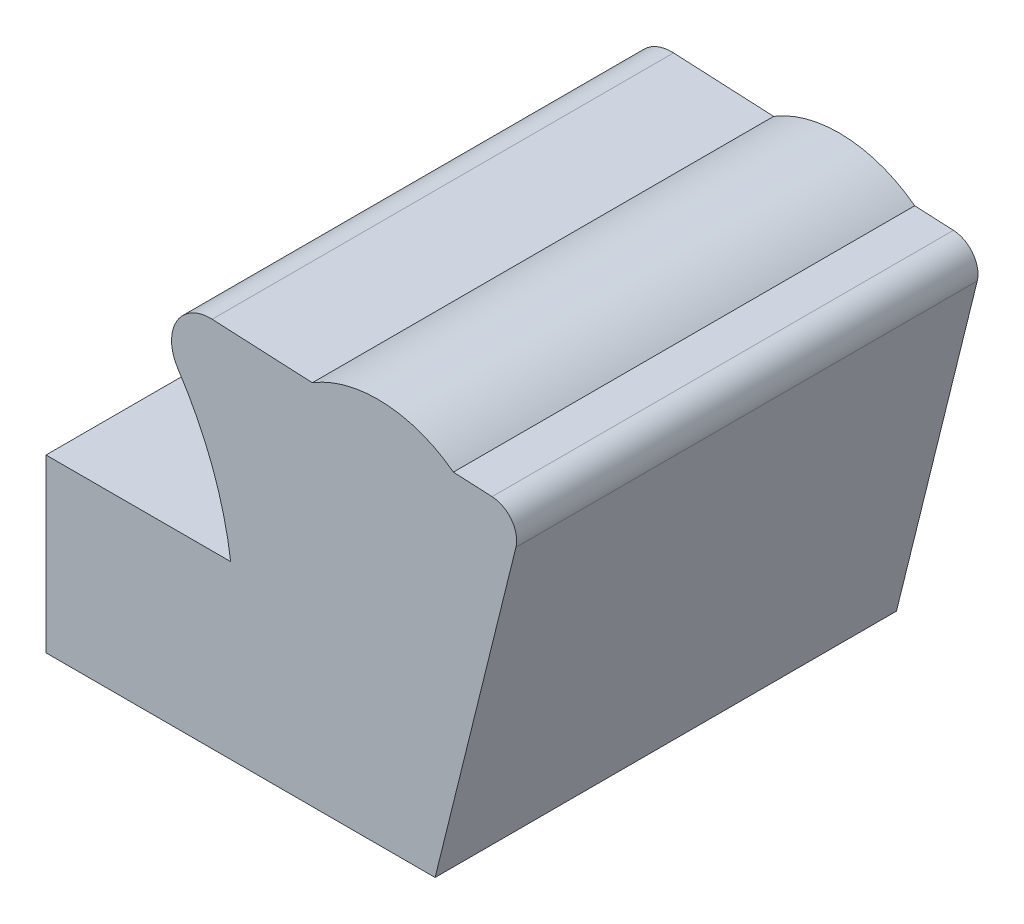
ISO-10303-21;
HEADER;
FILE_DESCRIPTION(('STEP AP214'),'2;1');
FILE_NAME('part.step','',(''),(''),'','','');
FILE_SCHEMA(('AUTOMOTIVE_DESIGN { 1 0 10303 214 1 1 1 1 }'));
ENDSEC;
DATA;
#1=APPLICATION_CONTEXT('core data for automotive mechanical design processes');
#2=APPLICATION_PROTOCOL_DEFINITION('international standard','automotive_design',2000,#1);
#3=PRODUCT_CONTEXT('',#1,'mechanical');
#4=PRODUCT('Part','Part','',(#3));
#5=PRODUCT_RELATED_PRODUCT_CATEGORY('part','',(#4));
#6=PRODUCT_DEFINITION_FORMATION('','',#4);
#7=PRODUCT_DEFINITION_CONTEXT('part definition',#1,'design');
#8=PRODUCT_DEFINITION('design','',#6,#7);
#9=PRODUCT_DEFINITION_SHAPE('','',#8);
#10=(LENGTH_UNIT() NAMED_UNIT(*) SI_UNIT(.MILLI.,.METRE.));
#11=(NAMED_UNIT(*) PLANE_ANGLE_UNIT() SI_UNIT($,.RADIAN.));
#12=(NAMED_UNIT(*) SI_UNIT($,.STERADIAN.) SOLID_ANGLE_UNIT());
#13=UNCERTAINTY_MEASURE_WITH_UNIT(LENGTH_MEASURE(1.E-05),#10,'distance_accuracy_value','');
#14=(GEOMETRIC_REPRESENTATION_CONTEXT(3) GLOBAL_UNCERTAINTY_ASSIGNED_CONTEXT((#13)) GLOBAL_UNIT_ASSIGNED_CONTEXT((#10,
#11,#12)) REPRESENTATION_CONTEXT('',''));
#15=CARTESIAN_POINT('',(0.,0.,0.));
#16=DIRECTION('',(0.,0.,1.));
#17=DIRECTION('',(1.,0.,0.));
#18=AXIS2_PLACEMENT_3D('',#15,#16,#17);
#19=CARTESIAN_POINT('',(117.61894034032,-29.1202319616591,50.));
#20=DIRECTION('',(-0.970692445387368,0.240325147389721,0.));
#21=DIRECTION('',(-0.240325147389721,-0.970692445387368,0.));
#22=AXIS2_PLACEMENT_3D('',#19,#20,#21);
#23=PLANE('',#22);
#24=DIRECTION('',(0.240325147389721,0.970692445387368,0.));
#25=VECTOR('',#24,1.);
#26=CARTESIAN_POINT('',(117.61894034032,-29.1202319616591,-50.));
#27=LINE('',#26,#25);
#28=CARTESIAN_POINT('',(136.603924056532,47.5616320433769,-50.));
#29=VERTEX_POINT('',#28);
#30=CARTESIAN_POINT('',(154.115877694168,118.293810030817,-50.));
#31=VERTEX_POINT('',#30);
#32=EDGE_CURVE('E178',#29,#31,#27,.T.);
#33=ORIENTED_EDGE('',*,*,#32,.T.);
#34=DIRECTION('',(0.,0.,-1.));
#35=VECTOR('',#34,1.);
#36=CARTESIAN_POINT('',(154.115877694168,118.293810030817,50.));
#37=LINE('',#36,#35);
#38=CARTESIAN_POINT('',(154.115877694168,118.293810030817,50.));
#39=VERTEX_POINT('',#38);
#40=EDGE_CURVE('E214',#39,#31,#37,.T.);
#41=ORIENTED_EDGE('',*,*,#40,.F.);
#42=DIRECTION('',(0.240325147389721,0.970692445387368,0.));
#43=VECTOR('',#42,1.);
#44=CARTESIAN_POINT('',(117.61894034032,-29.1202319616591,50.));
#45=LINE('',#44,#43);
#46=CARTESIAN_POINT('',(136.603924056532,47.5616320433769,50.));
#47=VERTEX_POINT('',#46);
#48=EDGE_CURVE('E149',#47,#39,#45,.T.);
#49=ORIENTED_EDGE('',*,*,#48,.F.);
#50=DIRECTION('',(0.,0.,-1.));
#51=VECTOR('',#50,1.);
#52=CARTESIAN_POINT('',(136.603924056532,47.5616320433769,50.));
#53=LINE('',#52,#51);
#54=EDGE_CURVE('E218',#47,#29,#53,.T.);
#55=ORIENTED_EDGE('',*,*,#54,.T.);
#56=EDGE_LOOP('',(#33,#41,#49,#55));
#57=FACE_BOUND('',#56,.T.);
#58=ADVANCED_FACE('F40',(#57),#23,.F.);
#59=CARTESIAN_POINT('',(148.680000000001,119.639630856199,50.));
#60=DIRECTION('',(0.,0.,-1.));
#61=DIRECTION('',(-1.,0.,0.));
#62=AXIS2_PLACEMENT_3D('',#59,#60,#61);
#63=CYLINDRICAL_SURFACE('',#62,5.59999999999944);
#64=CARTESIAN_POINT('',(148.680000000001,119.639630856199,-50.));
#65=DIRECTION('',(0.,0.,1.));
#66=DIRECTION('',(1.,0.,0.));
#67=AXIS2_PLACEMENT_3D('',#64,#65,#66);
#68=CIRCLE('',#67,5.59999999999944);
#69=CARTESIAN_POINT('',(148.953301039892,125.232957821575,-50.));
#70=VERTEX_POINT('',#69);
#71=EDGE_CURVE('E181',#31,#70,#68,.T.);
#72=ORIENTED_EDGE('',*,*,#71,.T.);
#73=DIRECTION('',(0.,0.,-1.));
#74=VECTOR('',#73,1.);
#75=CARTESIAN_POINT('',(148.953301039892,125.232957821575,50.));
#76=LINE('',#75,#74);
#77=CARTESIAN_POINT('',(148.953301039892,125.232957821575,50.));
#78=VERTEX_POINT('',#77);
#79=EDGE_CURVE('E210',#78,#70,#76,.T.);
#80=ORIENTED_EDGE('',*,*,#79,.F.);
#81=CARTESIAN_POINT('',(148.680000000001,119.639630856199,50.));
#82=DIRECTION('',(0.,0.,1.));
#83=DIRECTION('',(1.,0.,0.));
#84=AXIS2_PLACEMENT_3D('',#81,#82,#83);
#85=CIRCLE('',#84,5.59999999999944);
#86=EDGE_CURVE('E152',#39,#78,#85,.T.);
#87=ORIENTED_EDGE('',*,*,#86,.F.);
#88=ORIENTED_EDGE('',*,*,#40,.T.);
#89=EDGE_LOOP('',(#72,#80,#87,#88));
#90=FACE_BOUND('',#89,.T.);
#91=ADVANCED_FACE('F248',(#90),#63,.T.);
#92=CARTESIAN_POINT('',(6.45933388053893,132.195495438976,50.));
#93=DIRECTION('',(-0.0488037571233964,-0.998808386674161,0.));
#94=DIRECTION('',(0.998808386674161,-0.0488037571233964,0.));
#95=AXIS2_PLACEMENT_3D('',#92,#93,#94);
#96=PLANE('',#95);
#97=DIRECTION('',(-0.998808386674161,0.0488037571233964,0.));
#98=VECTOR('',#97,1.);
#99=CARTESIAN_POINT('',(6.45933388053893,132.195495438976,-50.));
#100=LINE('',#99,#98);
#101=CARTESIAN_POINT('',(140.564064784504,125.642872530063,-50.));
#102=VERTEX_POINT('',#101);
#103=EDGE_CURVE('E184',#70,#102,#100,.T.);
#104=ORIENTED_EDGE('',*,*,#103,.T.);
#105=DIRECTION('',(0.,0.,-1.));
#106=VECTOR('',#105,1.);
#107=CARTESIAN_POINT('',(140.564064784504,125.642872530063,50.));
#108=LINE('',#107,#106);
#109=CARTESIAN_POINT('',(140.564064784504,125.642872530063,50.));
#110=VERTEX_POINT('',#109);
#111=EDGE_CURVE('E206',#110,#102,#108,.T.);
#112=ORIENTED_EDGE('',*,*,#111,.F.);
#113=DIRECTION('',(-0.998808386674161,0.0488037571233964,0.));
#114=VECTOR('',#113,1.);
#115=CARTESIAN_POINT('',(6.45933388053893,132.195495438976,50.));
#116=LINE('',#115,#114);
#117=EDGE_CURVE('E155',#78,#110,#116,.T.);
#118=ORIENTED_EDGE('',*,*,#117,.F.);
#119=ORIENTED_EDGE('',*,*,#79,.T.);
#120=EDGE_LOOP('',(#104,#112,#118,#119));
#121=FACE_BOUND('',#120,.T.);
#122=ADVANCED_FACE('F243',(#121),#96,.F.);
#123=CARTESIAN_POINT('',(124.18,103.949999999997,50.));
#124=DIRECTION('',(0.,0.,-1.));
#125=DIRECTION('',(-1.,0.,0.));
#126=AXIS2_PLACEMENT_3D('',#123,#124,#125);
#127=CYLINDRICAL_SURFACE('',#126,27.1848909776837);
#128=CARTESIAN_POINT('',(124.18,103.949999999997,-50.));
#129=DIRECTION('',(0.,0.,1.));
#130=DIRECTION('',(1.,0.,0.));
#131=AXIS2_PLACEMENT_3D('',#128,#129,#130);
#132=CIRCLE('',#131,27.1848909776837);
#133=CARTESIAN_POINT('',(109.988846823888,127.136838270893,-50.));
#134=VERTEX_POINT('',#133);
#135=EDGE_CURVE('E187',#102,#134,#132,.T.);
#136=ORIENTED_EDGE('',*,*,#135,.T.);
#137=DIRECTION('',(0.,0.,-1.));
#138=VECTOR('',#137,1.);
#139=CARTESIAN_POINT('',(109.988846823888,127.136838270893,50.));
#140=LINE('',#139,#138);
#141=CARTESIAN_POINT('',(109.988846823888,127.136838270893,50.));
#142=VERTEX_POINT('',#141);
#143=EDGE_CURVE('E202',#142,#134,#140,.T.);
#144=ORIENTED_EDGE('',*,*,#143,.F.);
#145=CARTESIAN_POINT('',(124.18,103.949999999997,50.));
#146=DIRECTION('',(0.,0.,1.));
#147=DIRECTION('',(1.,0.,0.));
#148=AXIS2_PLACEMENT_3D('',#145,#146,#147);
#149=CIRCLE('',#148,27.1848909776837);
#150=EDGE_CURVE('E158',#110,#142,#149,.T.);
#151=ORIENTED_EDGE('',*,*,#150,.F.);
#152=ORIENTED_EDGE('',*,*,#111,.T.);
#153=EDGE_LOOP('',(#136,#144,#151,#152));
#154=FACE_BOUND('',#153,.T.);
#155=ADVANCED_FACE('F238',(#154),#127,.T.);
#156=CARTESIAN_POINT('',(6.45933388053893,132.195495438976,50.));
#157=DIRECTION('',(-0.0488037571233964,-0.998808386674161,0.));
#158=DIRECTION('',(0.998808386674161,-0.0488037571233964,0.));
#159=AXIS2_PLACEMENT_3D('',#156,#157,#158);
#160=PLANE('',#159);
#161=DIRECTION('',(-0.998808386674161,0.0488037571233964,0.));
#162=VECTOR('',#161,1.);
#163=CARTESIAN_POINT('',(6.45933388053893,132.195495438976,-50.));
#164=LINE('',#163,#162);
#165=CARTESIAN_POINT('',(88.2808494510845,128.197534041525,-50.));
#166=VERTEX_POINT('',#165);
#167=EDGE_CURVE('E190',#134,#166,#164,.T.);
#168=ORIENTED_EDGE('',*,*,#167,.T.);
#169=DIRECTION('',(0.,0.,-1.));
#170=VECTOR('',#169,1.);
#171=CARTESIAN_POINT('',(88.2808494510845,128.197534041525,50.));
#172=LINE('',#171,#170);
#173=CARTESIAN_POINT('',(88.2808494510845,128.197534041525,50.));
#174=VERTEX_POINT('',#173);
#175=EDGE_CURVE('E198',#174,#166,#172,.T.);
#176=ORIENTED_EDGE('',*,*,#175,.F.);
#177=DIRECTION('',(-0.998808386674161,0.0488037571233964,0.));
#178=VECTOR('',#177,1.);
#179=CARTESIAN_POINT('',(6.45933388053893,132.195495438976,50.));
#180=LINE('',#179,#178);
#181=EDGE_CURVE('E161',#142,#174,#180,.T.);
#182=ORIENTED_EDGE('',*,*,#181,.F.);
#183=ORIENTED_EDGE('',*,*,#143,.T.);
#184=EDGE_LOOP('',(#168,#176,#182,#183));
#185=FACE_BOUND('',#184,.T.);
#186=ADVANCED_FACE('F234',(#185),#160,.F.);
#187=CARTESIAN_POINT('',(87.8708978912478,119.807543593463,50.));
#188=DIRECTION('',(0.,0.,-1.));
#189=DIRECTION('',(-1.,0.,0.));
#190=AXIS2_PLACEMENT_3D('',#187,#188,#189);
#191=CYLINDRICAL_SURFACE('',#190,8.39999999999894);
#192=CARTESIAN_POINT('',(87.8708978912478,119.807543593463,-50.));
#193=DIRECTION('',(0.,0.,1.));
#194=DIRECTION('',(1.,0.,0.));
#195=AXIS2_PLACEMENT_3D('',#192,#193,#194);
#196=CIRCLE('',#195,8.39999999999894);
#197=CARTESIAN_POINT('',(80.8636833711651,115.175163571323,-50.));
#198=VERTEX_POINT('',#197);
#199=EDGE_CURVE('E137',#166,#198,#196,.T.);
#200=ORIENTED_EDGE('',*,*,#199,.T.);
#201=DIRECTION('',(0.,0.,-1.));
#202=VECTOR('',#201,1.);
#203=CARTESIAN_POINT('',(80.8636833711651,115.175163571323,50.));
#204=LINE('',#203,#202);
#205=CARTESIAN_POINT('',(80.8636833711651,115.175163571323,50.));
#206=VERTEX_POINT('',#205);
#207=EDGE_CURVE('E166',#206,#198,#204,.T.);
#208=ORIENTED_EDGE('',*,*,#207,.F.);
#209=CARTESIAN_POINT('',(87.8708978912478,119.807543593463,50.));
#210=DIRECTION('',(0.,0.,1.));
#211=DIRECTION('',(1.,0.,0.));
#212=AXIS2_PLACEMENT_3D('',#209,#210,#211);
#213=CIRCLE('',#212,8.39999999999894);
#214=EDGE_CURVE('E134',#174,#206,#213,.T.);
#215=ORIENTED_EDGE('',*,*,#214,.F.);
#216=ORIENTED_EDGE('',*,*,#175,.T.);
#217=EDGE_LOOP('',(#200,#208,#215,#216));
#218=FACE_BOUND('',#217,.T.);
#219=ADVANCED_FACE('F230',(#218),#191,.T.);
#220=CARTESIAN_POINT('',(20.1344908637742,75.0278700461048,50.));
#221=DIRECTION('',(0.,0.,-1.));
#222=DIRECTION('',(-1.,0.,0.));
#223=AXIS2_PLACEMENT_3D('',#220,#221,#222);
#224=CYLINDRICAL_SURFACE('',#223,72.7999999999985);
#225=CARTESIAN_POINT('',(20.1344908637742,75.0278700461048,-50.));
#226=DIRECTION('',(0.,0.,1.));
#227=DIRECTION('',(1.,0.,0.));
#228=AXIS2_PLACEMENT_3D('',#225,#226,#227);
#229=CIRCLE('',#228,72.7999999999985);
#230=CARTESIAN_POINT('',(92.2882238791872,84.706651577904,-50.));
#231=VERTEX_POINT('',#230);
#232=EDGE_CURVE('E121',#231,#198,#229,.T.);
#233=ORIENTED_EDGE('',*,*,#232,.F.);
#234=DIRECTION('',(0.,0.,-1.));
#235=VECTOR('',#234,1.);
#236=CARTESIAN_POINT('',(92.2882238791872,84.706651577904,50.));
#237=LINE('',#236,#235);
#238=CARTESIAN_POINT('',(92.2882238791872,84.706651577904,50.));
#239=VERTEX_POINT('',#238);
#240=EDGE_CURVE('E49',#239,#231,#237,.T.);
#241=ORIENTED_EDGE('',*,*,#240,.F.);
#242=CARTESIAN_POINT('',(20.1344908637742,75.0278700461048,50.));
#243=DIRECTION('',(0.,0.,1.));
#244=DIRECTION('',(1.,0.,0.));
#245=AXIS2_PLACEMENT_3D('',#242,#243,#244);
#246=CIRCLE('',#245,72.7999999999985);
#247=EDGE_CURVE('E119',#239,#206,#246,.T.);
#248=ORIENTED_EDGE('',*,*,#247,.T.);
#249=ORIENTED_EDGE('',*,*,#207,.T.);
#250=EDGE_LOOP('',(#233,#241,#248,#249));
#251=FACE_BOUND('',#250,.T.);
#252=ADVANCED_FACE('F42',(#251),#224,.F.);
#253=CARTESIAN_POINT('',(0.,84.706651577904,50.));
#254=DIRECTION('',(0.,1.,0.));
#255=DIRECTION('',(0.,0.,1.));
#256=AXIS2_PLACEMENT_3D('',#253,#254,#255);
#257=PLANE('',#256);
#258=DIRECTION('',(1.,0.,0.));
#259=VECTOR('',#258,1.);
#260=CARTESIAN_POINT('',(0.,84.706651577904,-50.));
#261=LINE('',#260,#259);
#262=CARTESIAN_POINT('',(52.259104563702,84.706651577904,-50.));
#263=VERTEX_POINT('',#262);
#264=EDGE_CURVE('E169',#263,#231,#261,.T.);
#265=ORIENTED_EDGE('',*,*,#264,.F.);
#266=DIRECTION('',(0.,0.,-1.));
#267=VECTOR('',#266,1.);
#268=CARTESIAN_POINT('',(52.259104563702,84.706651577904,50.));
#269=LINE('',#268,#267);
#270=CARTESIAN_POINT('',(52.259104563702,84.706651577904,50.));
#271=VERTEX_POINT('',#270);
#272=EDGE_CURVE('E127',#271,#263,#269,.T.);
#273=ORIENTED_EDGE('',*,*,#272,.F.);
#274=DIRECTION('',(1.,0.,0.));
#275=VECTOR('',#274,1.);
#276=CARTESIAN_POINT('',(0.,84.706651577904,50.));
#277=LINE('',#276,#275);
#278=EDGE_CURVE('E132',#271,#239,#277,.T.);
#279=ORIENTED_EDGE('',*,*,#278,.T.);
#280=ORIENTED_EDGE('',*,*,#240,.T.);
#281=EDGE_LOOP('',(#265,#273,#279,#280));
#282=FACE_BOUND('',#281,.T.);
#283=ADVANCED_FACE('F139',(#282),#257,.T.);
#284=CARTESIAN_POINT('',(52.259104563702,0.,50.));
#285=DIRECTION('',(1.,0.,0.));
#286=DIRECTION('',(0.,1.,0.));
#287=AXIS2_PLACEMENT_3D('',#284,#285,#286);
#288=PLANE('',#287);
#289=DIRECTION('',(0.,-1.,0.));
#290=VECTOR('',#289,1.);
#291=CARTESIAN_POINT('',(52.259104563702,0.,-50.));
#292=LINE('',#291,#290);
#293=CARTESIAN_POINT('',(52.259104563702,47.5616320433758,-50.));
#294=VERTEX_POINT('',#293);
#295=EDGE_CURVE('E172',#263,#294,#292,.T.);
#296=ORIENTED_EDGE('',*,*,#295,.T.);
#297=DIRECTION('',(0.,0.,1.));
#298=VECTOR('',#297,1.);
#299=CARTESIAN_POINT('',(52.259104563702,47.5616320433758,50.));
#300=LINE('',#299,#298);
#301=CARTESIAN_POINT('',(52.259104563702,47.5616320433758,50.));
#302=VERTEX_POINT('',#301);
#303=EDGE_CURVE('E11',#294,#302,#300,.T.);
#304=ORIENTED_EDGE('',*,*,#303,.T.);
#305=DIRECTION('',(0.,-1.,0.));
#306=VECTOR('',#305,1.);
#307=CARTESIAN_POINT('',(52.259104563702,0.,50.));
#308=LINE('',#307,#306);
#309=EDGE_CURVE('E142',#271,#302,#308,.T.);
#310=ORIENTED_EDGE('',*,*,#309,.F.);
#311=ORIENTED_EDGE('',*,*,#272,.T.);
#312=EDGE_LOOP('',(#296,#304,#310,#311));
#313=FACE_BOUND('',#312,.T.);
#314=ADVANCED_FACE('F224',(#313),#288,.F.);
#315=CARTESIAN_POINT('',(-3.23470938862787E-12,47.5616320433676,50.));
#316=DIRECTION('',(0.,1.,0.));
#317=DIRECTION('',(-1.,0.,0.));
#318=AXIS2_PLACEMENT_3D('',#315,#316,#317);
#319=PLANE('',#318);
#320=DIRECTION('',(1.,0.,0.));
#321=VECTOR('',#320,1.);
#322=CARTESIAN_POINT('',(-3.23470938862787E-12,47.5616320433676,-50.));
#323=LINE('',#322,#321);
#324=EDGE_CURVE('E63',#294,#29,#323,.T.);
#325=ORIENTED_EDGE('',*,*,#324,.T.);
#326=ORIENTED_EDGE('',*,*,#54,.F.);
#327=DIRECTION('',(1.,0.,0.));
#328=VECTOR('',#327,1.);
#329=CARTESIAN_POINT('',(-3.23470938862787E-12,47.5616320433676,50.));
#330=LINE('',#329,#328);
#331=EDGE_CURVE('E56',#302,#47,#330,.T.);
#332=ORIENTED_EDGE('',*,*,#331,.F.);
#333=ORIENTED_EDGE('',*,*,#303,.F.);
#334=EDGE_LOOP('',(#325,#326,#332,#333));
#335=FACE_BOUND('',#334,.T.);
#336=ADVANCED_FACE('F252',(#335),#319,.F.);
#337=CARTESIAN_POINT('',(0.,0.,-50.));
#338=DIRECTION('',(0.,0.,1.));
#339=DIRECTION('',(1.,0.,0.));
#340=AXIS2_PLACEMENT_3D('',#337,#338,#339);
#341=PLANE('',#340);
#342=ORIENTED_EDGE('',*,*,#324,.F.);
#343=ORIENTED_EDGE('',*,*,#295,.F.);
#344=ORIENTED_EDGE('',*,*,#264,.T.);
#345=ORIENTED_EDGE('',*,*,#232,.T.);
#346=ORIENTED_EDGE('',*,*,#199,.F.);
#347=ORIENTED_EDGE('',*,*,#167,.F.);
#348=ORIENTED_EDGE('',*,*,#135,.F.);
#349=ORIENTED_EDGE('',*,*,#103,.F.);
#350=ORIENTED_EDGE('',*,*,#71,.F.);
#351=ORIENTED_EDGE('',*,*,#32,.F.);
#352=EDGE_LOOP('',(#342,#343,#344,#345,#346,#347,#348,#349,#350,#351));
#353=FACE_BOUND('',#352,.T.);
#354=ADVANCED_FACE('F225',(#353),#341,.F.);
#355=CARTESIAN_POINT('',(0.,0.,50.));
#356=DIRECTION('',(0.,0.,1.));
#357=DIRECTION('',(1.,0.,0.));
#358=AXIS2_PLACEMENT_3D('',#355,#356,#357);
#359=PLANE('',#358);
#360=ORIENTED_EDGE('',*,*,#309,.T.);
#361=ORIENTED_EDGE('',*,*,#331,.T.);
#362=ORIENTED_EDGE('',*,*,#48,.T.);
#363=ORIENTED_EDGE('',*,*,#86,.T.);
#364=ORIENTED_EDGE('',*,*,#117,.T.);
#365=ORIENTED_EDGE('',*,*,#150,.T.);
#366=ORIENTED_EDGE('',*,*,#181,.T.);
#367=ORIENTED_EDGE('',*,*,#214,.T.);
#368=ORIENTED_EDGE('',*,*,#247,.F.);
#369=ORIENTED_EDGE('',*,*,#278,.F.);
#370=EDGE_LOOP('',(#360,#361,#362,#363,#364,#365,#366,#367,#368,#369));
#371=FACE_BOUND('',#370,.T.);
#372=ADVANCED_FACE('F131',(#371),#359,.T.);
#373=CLOSED_SHELL('',(#58,#91,#122,#155,#186,#219,#252,#283,#314,#336,#354,#372));
#374=MANIFOLD_SOLID_BREP('B2',#373);
#375=ADVANCED_BREP_SHAPE_REPRESENTATION('',(#18,#374),#14);
#376=SHAPE_DEFINITION_REPRESENTATION(#9,#375);
ENDSEC;
END-ISO-10303-21;
